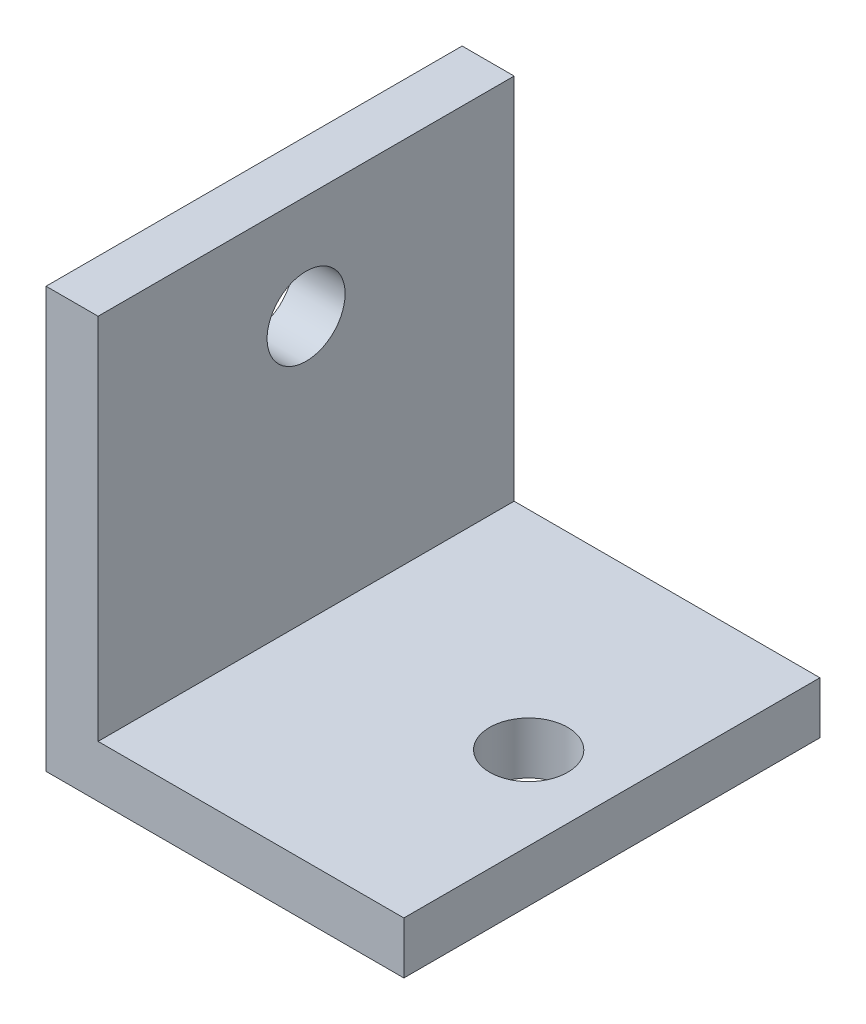
ISO-10303-21;
HEADER;
FILE_DESCRIPTION(('STEP AP214'),'2;1');
FILE_NAME('part.step','',(''),(''),'','','');
FILE_SCHEMA(('AUTOMOTIVE_DESIGN { 1 0 10303 214 1 1 1 1 }'));
ENDSEC;
DATA;
#1=APPLICATION_CONTEXT('core data for automotive mechanical design processes');
#2=APPLICATION_PROTOCOL_DEFINITION('international standard','automotive_design',2000,#1);
#3=PRODUCT_CONTEXT('',#1,'mechanical');
#4=PRODUCT('Part','Part','',(#3));
#5=PRODUCT_RELATED_PRODUCT_CATEGORY('part','',(#4));
#6=PRODUCT_DEFINITION_FORMATION('','',#4);
#7=PRODUCT_DEFINITION_CONTEXT('part definition',#1,'design');
#8=PRODUCT_DEFINITION('design','',#6,#7);
#9=PRODUCT_DEFINITION_SHAPE('','',#8);
#10=(LENGTH_UNIT() NAMED_UNIT(*) SI_UNIT(.MILLI.,.METRE.));
#11=(NAMED_UNIT(*) PLANE_ANGLE_UNIT() SI_UNIT($,.RADIAN.));
#12=(NAMED_UNIT(*) SI_UNIT($,.STERADIAN.) SOLID_ANGLE_UNIT());
#13=UNCERTAINTY_MEASURE_WITH_UNIT(LENGTH_MEASURE(1.E-05),#10,'distance_accuracy_value','');
#14=(GEOMETRIC_REPRESENTATION_CONTEXT(3) GLOBAL_UNCERTAINTY_ASSIGNED_CONTEXT((#13)) GLOBAL_UNIT_ASSIGNED_CONTEXT((#10,
#11,#12)) REPRESENTATION_CONTEXT('',''));
#15=CARTESIAN_POINT('',(0.,0.,0.));
#16=DIRECTION('',(0.,0.,1.));
#17=DIRECTION('',(1.,0.,0.));
#18=AXIS2_PLACEMENT_3D('',#15,#16,#17);
#19=CARTESIAN_POINT('',(0.,0.,25.4));
#20=DIRECTION('',(0.,1.,0.));
#21=DIRECTION('',(0.,0.,1.));
#22=AXIS2_PLACEMENT_3D('',#19,#20,#21);
#23=PLANE('',#22);
#24=CARTESIAN_POINT('',(16.764,0.,12.7));
#25=DIRECTION('',(0.,1.,0.));
#26=DIRECTION('',(0.,0.,1.));
#27=AXIS2_PLACEMENT_3D('',#24,#25,#26);
#28=CIRCLE('',#27,2.38125000000001);
#29=CARTESIAN_POINT('',(16.764,0.,15.08125));
#30=VERTEX_POINT('',#29);
#31=EDGE_CURVE('E161',#30,#30,#28,.T.);
#32=ORIENTED_EDGE('',*,*,#31,.T.);
#33=EDGE_LOOP('',(#32));
#34=FACE_BOUND('',#33,.T.);
#35=DIRECTION('',(1.,0.,0.));
#36=VECTOR('',#35,1.);
#37=CARTESIAN_POINT('',(0.,0.,0.));
#38=LINE('',#37,#36);
#39=CARTESIAN_POINT('',(0.,0.,0.));
#40=VERTEX_POINT('',#39);
#41=CARTESIAN_POINT('',(21.844,0.,0.));
#42=VERTEX_POINT('',#41);
#43=EDGE_CURVE('E117',#40,#42,#38,.T.);
#44=ORIENTED_EDGE('',*,*,#43,.T.);
#45=DIRECTION('',(0.,0.,-1.));
#46=VECTOR('',#45,1.);
#47=CARTESIAN_POINT('',(21.844,0.,25.4));
#48=LINE('',#47,#46);
#49=CARTESIAN_POINT('',(21.844,0.,25.4));
#50=VERTEX_POINT('',#49);
#51=EDGE_CURVE('E11',#50,#42,#48,.T.);
#52=ORIENTED_EDGE('',*,*,#51,.F.);
#53=DIRECTION('',(1.,0.,0.));
#54=VECTOR('',#53,1.);
#55=CARTESIAN_POINT('',(0.,0.,25.4));
#56=LINE('',#55,#54);
#57=CARTESIAN_POINT('',(0.,0.,25.4));
#58=VERTEX_POINT('',#57);
#59=EDGE_CURVE('E128',#58,#50,#56,.T.);
#60=ORIENTED_EDGE('',*,*,#59,.F.);
#61=DIRECTION('',(0.,0.,-1.));
#62=VECTOR('',#61,1.);
#63=CARTESIAN_POINT('',(0.,0.,25.4));
#64=LINE('',#63,#62);
#65=EDGE_CURVE('E113',#58,#40,#64,.T.);
#66=ORIENTED_EDGE('',*,*,#65,.T.);
#67=EDGE_LOOP('',(#44,#52,#60,#66));
#68=FACE_BOUND('',#67,.T.);
#69=ADVANCED_FACE('F33',(#34,#68),#23,.F.);
#70=CARTESIAN_POINT('',(21.844,0.,25.4));
#71=DIRECTION('',(-1.,0.,0.));
#72=DIRECTION('',(0.,0.,1.));
#73=AXIS2_PLACEMENT_3D('',#70,#71,#72);
#74=PLANE('',#73);
#75=DIRECTION('',(0.,1.,0.));
#76=VECTOR('',#75,1.);
#77=CARTESIAN_POINT('',(21.844,0.,0.));
#78=LINE('',#77,#76);
#79=CARTESIAN_POINT('',(21.844,3.175,0.));
#80=VERTEX_POINT('',#79);
#81=EDGE_CURVE('E120',#42,#80,#78,.T.);
#82=ORIENTED_EDGE('',*,*,#81,.T.);
#83=DIRECTION('',(0.,0.,-1.));
#84=VECTOR('',#83,1.);
#85=CARTESIAN_POINT('',(21.844,3.175,25.4));
#86=LINE('',#85,#84);
#87=CARTESIAN_POINT('',(21.844,3.175,25.4));
#88=VERTEX_POINT('',#87);
#89=EDGE_CURVE('E41',#88,#80,#86,.T.);
#90=ORIENTED_EDGE('',*,*,#89,.F.);
#91=DIRECTION('',(0.,1.,0.));
#92=VECTOR('',#91,1.);
#93=CARTESIAN_POINT('',(21.844,0.,25.4));
#94=LINE('',#93,#92);
#95=EDGE_CURVE('E86',#50,#88,#94,.T.);
#96=ORIENTED_EDGE('',*,*,#95,.F.);
#97=ORIENTED_EDGE('',*,*,#51,.T.);
#98=EDGE_LOOP('',(#82,#90,#96,#97));
#99=FACE_BOUND('',#98,.T.);
#100=ADVANCED_FACE('F154',(#99),#74,.F.);
#101=CARTESIAN_POINT('',(3.175,3.175,25.4));
#102=DIRECTION('',(0.,-1.,0.));
#103=DIRECTION('',(0.,0.,-1.));
#104=AXIS2_PLACEMENT_3D('',#101,#102,#103);
#105=PLANE('',#104);
#106=CARTESIAN_POINT('',(16.764,3.175,12.7));
#107=DIRECTION('',(0.,1.,0.));
#108=DIRECTION('',(0.,0.,1.));
#109=AXIS2_PLACEMENT_3D('',#106,#107,#108);
#110=CIRCLE('',#109,2.38125000000001);
#111=CARTESIAN_POINT('',(16.764,3.175,15.08125));
#112=VERTEX_POINT('',#111);
#113=EDGE_CURVE('E164',#112,#112,#110,.T.);
#114=ORIENTED_EDGE('',*,*,#113,.F.);
#115=EDGE_LOOP('',(#114));
#116=FACE_BOUND('',#115,.T.);
#117=DIRECTION('',(-1.,0.,0.));
#118=VECTOR('',#117,1.);
#119=CARTESIAN_POINT('',(3.175,3.175,0.));
#120=LINE('',#119,#118);
#121=CARTESIAN_POINT('',(3.175,3.175,0.));
#122=VERTEX_POINT('',#121);
#123=EDGE_CURVE('E123',#80,#122,#120,.T.);
#124=ORIENTED_EDGE('',*,*,#123,.T.);
#125=DIRECTION('',(0.,0.,-1.));
#126=VECTOR('',#125,1.);
#127=CARTESIAN_POINT('',(3.175,3.175,25.4));
#128=LINE('',#127,#126);
#129=CARTESIAN_POINT('',(3.175,3.175,25.4));
#130=VERTEX_POINT('',#129);
#131=EDGE_CURVE('E108',#130,#122,#128,.T.);
#132=ORIENTED_EDGE('',*,*,#131,.F.);
#133=DIRECTION('',(-1.,0.,0.));
#134=VECTOR('',#133,1.);
#135=CARTESIAN_POINT('',(3.175,3.175,25.4));
#136=LINE('',#135,#134);
#137=EDGE_CURVE('E99',#88,#130,#136,.T.);
#138=ORIENTED_EDGE('',*,*,#137,.F.);
#139=ORIENTED_EDGE('',*,*,#89,.T.);
#140=EDGE_LOOP('',(#124,#132,#138,#139));
#141=FACE_BOUND('',#140,.T.);
#142=ADVANCED_FACE('F134',(#116,#141),#105,.F.);
#143=CARTESIAN_POINT('',(3.175,25.654,25.4));
#144=DIRECTION('',(-1.,0.,0.));
#145=DIRECTION('',(0.,0.,1.));
#146=AXIS2_PLACEMENT_3D('',#143,#144,#145);
#147=PLANE('',#146);
#148=CARTESIAN_POINT('',(3.175,19.304,12.7));
#149=DIRECTION('',(1.,0.,0.));
#150=DIRECTION('',(0.,0.,-1.));
#151=AXIS2_PLACEMENT_3D('',#148,#149,#150);
#152=CIRCLE('',#151,2.38125);
#153=CARTESIAN_POINT('',(3.175,19.304,10.31875));
#154=VERTEX_POINT('',#153);
#155=EDGE_CURVE('E163',#154,#154,#152,.T.);
#156=ORIENTED_EDGE('',*,*,#155,.F.);
#157=EDGE_LOOP('',(#156));
#158=FACE_BOUND('',#157,.T.);
#159=DIRECTION('',(0.,1.,0.));
#160=VECTOR('',#159,1.);
#161=CARTESIAN_POINT('',(3.175,25.654,0.));
#162=LINE('',#161,#160);
#163=CARTESIAN_POINT('',(3.175,25.654,0.));
#164=VERTEX_POINT('',#163);
#165=EDGE_CURVE('E107',#122,#164,#162,.T.);
#166=ORIENTED_EDGE('',*,*,#165,.T.);
#167=DIRECTION('',(0.,0.,-1.));
#168=VECTOR('',#167,1.);
#169=CARTESIAN_POINT('',(3.175,25.654,25.4));
#170=LINE('',#169,#168);
#171=CARTESIAN_POINT('',(3.175,25.654,25.4));
#172=VERTEX_POINT('',#171);
#173=EDGE_CURVE('E104',#172,#164,#170,.T.);
#174=ORIENTED_EDGE('',*,*,#173,.F.);
#175=DIRECTION('',(0.,1.,0.));
#176=VECTOR('',#175,1.);
#177=CARTESIAN_POINT('',(3.175,25.654,25.4));
#178=LINE('',#177,#176);
#179=EDGE_CURVE('E93',#130,#172,#178,.T.);
#180=ORIENTED_EDGE('',*,*,#179,.F.);
#181=ORIENTED_EDGE('',*,*,#131,.T.);
#182=EDGE_LOOP('',(#166,#174,#180,#181));
#183=FACE_BOUND('',#182,.T.);
#184=ADVANCED_FACE('F105',(#158,#183),#147,.F.);
#185=CARTESIAN_POINT('',(0.,25.654,25.4));
#186=DIRECTION('',(0.,-1.,0.));
#187=DIRECTION('',(0.,0.,-1.));
#188=AXIS2_PLACEMENT_3D('',#185,#186,#187);
#189=PLANE('',#188);
#190=DIRECTION('',(-1.,0.,0.));
#191=VECTOR('',#190,1.);
#192=CARTESIAN_POINT('',(0.,25.654,0.));
#193=LINE('',#192,#191);
#194=CARTESIAN_POINT('',(0.,25.654,0.));
#195=VERTEX_POINT('',#194);
#196=EDGE_CURVE('E72',#164,#195,#193,.T.);
#197=ORIENTED_EDGE('',*,*,#196,.T.);
#198=DIRECTION('',(0.,0.,-1.));
#199=VECTOR('',#198,1.);
#200=CARTESIAN_POINT('',(0.,25.654,25.4));
#201=LINE('',#200,#199);
#202=CARTESIAN_POINT('',(0.,25.654,25.4));
#203=VERTEX_POINT('',#202);
#204=EDGE_CURVE('E109',#203,#195,#201,.T.);
#205=ORIENTED_EDGE('',*,*,#204,.F.);
#206=DIRECTION('',(-1.,0.,0.));
#207=VECTOR('',#206,1.);
#208=CARTESIAN_POINT('',(0.,25.654,25.4));
#209=LINE('',#208,#207);
#210=EDGE_CURVE('E97',#172,#203,#209,.T.);
#211=ORIENTED_EDGE('',*,*,#210,.F.);
#212=ORIENTED_EDGE('',*,*,#173,.T.);
#213=EDGE_LOOP('',(#197,#205,#211,#212));
#214=FACE_BOUND('',#213,.T.);
#215=ADVANCED_FACE('F111',(#214),#189,.F.);
#216=CARTESIAN_POINT('',(0.,0.,25.4));
#217=DIRECTION('',(1.,0.,0.));
#218=DIRECTION('',(0.,0.,-1.));
#219=AXIS2_PLACEMENT_3D('',#216,#217,#218);
#220=PLANE('',#219);
#221=CARTESIAN_POINT('',(0.,19.304,12.7));
#222=DIRECTION('',(1.,0.,0.));
#223=DIRECTION('',(0.,0.,-1.));
#224=AXIS2_PLACEMENT_3D('',#221,#222,#223);
#225=CIRCLE('',#224,2.38125);
#226=CARTESIAN_POINT('',(0.,19.304,10.31875));
#227=VERTEX_POINT('',#226);
#228=EDGE_CURVE('E121',#227,#227,#225,.T.);
#229=ORIENTED_EDGE('',*,*,#228,.T.);
#230=EDGE_LOOP('',(#229));
#231=FACE_BOUND('',#230,.T.);
#232=DIRECTION('',(0.,-1.,0.));
#233=VECTOR('',#232,1.);
#234=CARTESIAN_POINT('',(0.,0.,0.));
#235=LINE('',#234,#233);
#236=EDGE_CURVE('E78',#195,#40,#235,.T.);
#237=ORIENTED_EDGE('',*,*,#236,.T.);
#238=ORIENTED_EDGE('',*,*,#65,.F.);
#239=DIRECTION('',(0.,-1.,0.));
#240=VECTOR('',#239,1.);
#241=CARTESIAN_POINT('',(0.,0.,25.4));
#242=LINE('',#241,#240);
#243=EDGE_CURVE('E49',#203,#58,#242,.T.);
#244=ORIENTED_EDGE('',*,*,#243,.F.);
#245=ORIENTED_EDGE('',*,*,#204,.T.);
#246=EDGE_LOOP('',(#237,#238,#244,#245));
#247=FACE_BOUND('',#246,.T.);
#248=ADVANCED_FACE('F141',(#231,#247),#220,.F.);
#249=CARTESIAN_POINT('',(0.,0.,25.4));
#250=DIRECTION('',(0.,0.,1.));
#251=DIRECTION('',(1.,0.,0.));
#252=AXIS2_PLACEMENT_3D('',#249,#250,#251);
#253=PLANE('',#252);
#254=ORIENTED_EDGE('',*,*,#59,.T.);
#255=ORIENTED_EDGE('',*,*,#95,.T.);
#256=ORIENTED_EDGE('',*,*,#137,.T.);
#257=ORIENTED_EDGE('',*,*,#179,.T.);
#258=ORIENTED_EDGE('',*,*,#210,.T.);
#259=ORIENTED_EDGE('',*,*,#243,.T.);
#260=EDGE_LOOP('',(#254,#255,#256,#257,#258,#259));
#261=FACE_BOUND('',#260,.T.);
#262=ADVANCED_FACE('F95',(#261),#253,.T.);
#263=CARTESIAN_POINT('',(0.,0.,0.));
#264=DIRECTION('',(0.,0.,1.));
#265=DIRECTION('',(1.,0.,0.));
#266=AXIS2_PLACEMENT_3D('',#263,#264,#265);
#267=PLANE('',#266);
#268=ORIENTED_EDGE('',*,*,#43,.F.);
#269=ORIENTED_EDGE('',*,*,#236,.F.);
#270=ORIENTED_EDGE('',*,*,#196,.F.);
#271=ORIENTED_EDGE('',*,*,#165,.F.);
#272=ORIENTED_EDGE('',*,*,#123,.F.);
#273=ORIENTED_EDGE('',*,*,#81,.F.);
#274=EDGE_LOOP('',(#268,#269,#270,#271,#272,#273));
#275=FACE_BOUND('',#274,.T.);
#276=ADVANCED_FACE('F137',(#275),#267,.F.);
#277=CARTESIAN_POINT('',(0.,19.304,12.7));
#278=DIRECTION('',(1.,0.,0.));
#279=DIRECTION('',(0.,0.,-1.));
#280=AXIS2_PLACEMENT_3D('',#277,#278,#279);
#281=CYLINDRICAL_SURFACE('',#280,2.38125);
#282=ORIENTED_EDGE('',*,*,#228,.F.);
#283=EDGE_LOOP('',(#282));
#284=FACE_BOUND('',#283,.T.);
#285=ORIENTED_EDGE('',*,*,#155,.T.);
#286=EDGE_LOOP('',(#285));
#287=FACE_BOUND('',#286,.T.);
#288=ADVANCED_FACE('F175',(#284,#287),#281,.F.);
#289=CARTESIAN_POINT('',(16.764,0.,12.7));
#290=DIRECTION('',(0.,1.,0.));
#291=DIRECTION('',(0.,0.,1.));
#292=AXIS2_PLACEMENT_3D('',#289,#290,#291);
#293=CYLINDRICAL_SURFACE('',#292,2.38125000000001);
#294=ORIENTED_EDGE('',*,*,#31,.F.);
#295=EDGE_LOOP('',(#294));
#296=FACE_BOUND('',#295,.T.);
#297=ORIENTED_EDGE('',*,*,#113,.T.);
#298=EDGE_LOOP('',(#297));
#299=FACE_BOUND('',#298,.T.);
#300=ADVANCED_FACE('F178',(#296,#299),#293,.F.);
#301=CLOSED_SHELL('',(#69,#100,#142,#184,#215,#248,#262,#276,#288,#300));
#302=MANIFOLD_SOLID_BREP('B2',#301);
#303=ADVANCED_BREP_SHAPE_REPRESENTATION('',(#18,#302),#14);
#304=SHAPE_DEFINITION_REPRESENTATION(#9,#303);
ENDSEC;
END-ISO-10303-21;
